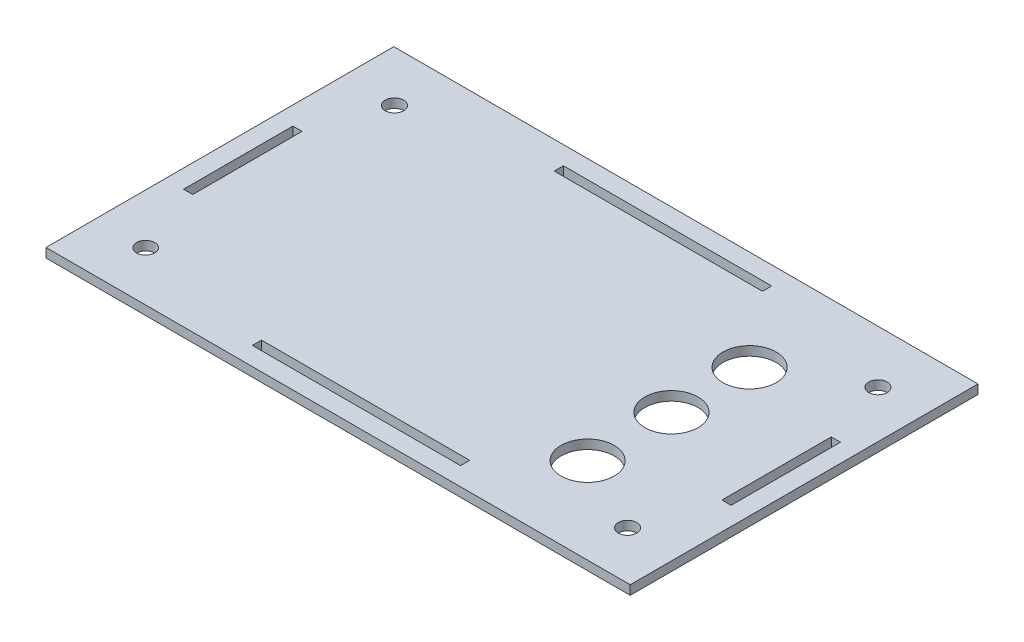
ISO-10303-21;
HEADER;
FILE_DESCRIPTION(('STEP AP214'),'2;1');
FILE_NAME('part.step','',(''),(''),'','','');
FILE_SCHEMA(('AUTOMOTIVE_DESIGN { 1 0 10303 214 1 1 1 1 }'));
ENDSEC;
DATA;
#1=APPLICATION_CONTEXT('core data for automotive mechanical design processes');
#2=APPLICATION_PROTOCOL_DEFINITION('international standard','automotive_design',2000,#1);
#3=PRODUCT_CONTEXT('',#1,'mechanical');
#4=PRODUCT('Part','Part','',(#3));
#5=PRODUCT_RELATED_PRODUCT_CATEGORY('part','',(#4));
#6=PRODUCT_DEFINITION_FORMATION('','',#4);
#7=PRODUCT_DEFINITION_CONTEXT('part definition',#1,'design');
#8=PRODUCT_DEFINITION('design','',#6,#7);
#9=PRODUCT_DEFINITION_SHAPE('','',#8);
#10=(LENGTH_UNIT() NAMED_UNIT(*) SI_UNIT(.MILLI.,.METRE.));
#11=(NAMED_UNIT(*) PLANE_ANGLE_UNIT() SI_UNIT($,.RADIAN.));
#12=(NAMED_UNIT(*) SI_UNIT($,.STERADIAN.) SOLID_ANGLE_UNIT());
#13=UNCERTAINTY_MEASURE_WITH_UNIT(LENGTH_MEASURE(1.E-05),#10,'distance_accuracy_value','');
#14=(GEOMETRIC_REPRESENTATION_CONTEXT(3) GLOBAL_UNCERTAINTY_ASSIGNED_CONTEXT((#13)) GLOBAL_UNIT_ASSIGNED_CONTEXT((#10,
#11,#12)) REPRESENTATION_CONTEXT('',''));
#15=CARTESIAN_POINT('',(0.,0.,0.));
#16=DIRECTION('',(0.,0.,1.));
#17=DIRECTION('',(1.,0.,0.));
#18=AXIS2_PLACEMENT_3D('',#15,#16,#17);
#19=CARTESIAN_POINT('',(0.,2.,0.));
#20=DIRECTION('',(0.,1.,0.));
#21=DIRECTION('',(0.,0.,1.));
#22=AXIS2_PLACEMENT_3D('',#19,#20,#21);
#23=PLANE('',#22);
#24=CARTESIAN_POINT('',(3.69534668895955,2.,-3.58517685274402));
#25=DIRECTION('',(0.,1.,0.));
#26=DIRECTION('',(0.,0.,1.));
#27=AXIS2_PLACEMENT_3D('',#24,#25,#26);
#28=CIRCLE('',#27,1.97543439169033);
#29=CARTESIAN_POINT('',(3.69534668895955,2.,-1.60974246105369));
#30=VERTEX_POINT('',#29);
#31=EDGE_CURVE('E567',#30,#30,#28,.T.);
#32=ORIENTED_EDGE('',*,*,#31,.F.);
#33=EDGE_LOOP('',(#32));
#34=FACE_BOUND('',#33,.T.);
#35=CARTESIAN_POINT('',(109.903070513536,2.,-57.085639350411));
#36=DIRECTION('',(0.,1.,0.));
#37=DIRECTION('',(0.,0.,1.));
#38=AXIS2_PLACEMENT_3D('',#35,#36,#37);
#39=CIRCLE('',#38,2.00578430429312);
#40=CARTESIAN_POINT('',(109.903070513536,2.,-55.0798550461179));
#41=VERTEX_POINT('',#40);
#42=EDGE_CURVE('E583',#41,#41,#39,.T.);
#43=ORIENTED_EDGE('',*,*,#42,.F.);
#44=EDGE_LOOP('',(#43));
#45=FACE_BOUND('',#44,.T.);
#46=DIRECTION('',(-1.,0.,0.));
#47=VECTOR('',#46,1.);
#48=CARTESIAN_POINT('',(79.1865431696985,2.,1.22187722593417));
#49=LINE('',#48,#47);
#50=CARTESIAN_POINT('',(79.1865431696985,2.,1.22187722593417));
#51=VERTEX_POINT('',#50);
#52=CARTESIAN_POINT('',(33.7765431696985,2.,1.22187722593417));
#53=VERTEX_POINT('',#52);
#54=EDGE_CURVE('E186',#51,#53,#49,.T.);
#55=ORIENTED_EDGE('',*,*,#54,.F.);
#56=DIRECTION('',(0.,0.,-1.));
#57=VECTOR('',#56,1.);
#58=CARTESIAN_POINT('',(79.1865431696985,2.,1.22187722593417));
#59=LINE('',#58,#57);
#60=CARTESIAN_POINT('',(79.1865431696985,2.,3.22187722593417));
#61=VERTEX_POINT('',#60);
#62=EDGE_CURVE('E177',#61,#51,#59,.T.);
#63=ORIENTED_EDGE('',*,*,#62,.F.);
#64=DIRECTION('',(1.,0.,0.));
#65=VECTOR('',#64,1.);
#66=CARTESIAN_POINT('',(79.1865431696985,2.,3.22187722593417));
#67=LINE('',#66,#65);
#68=CARTESIAN_POINT('',(33.7765431696985,2.,3.22187722593417));
#69=VERTEX_POINT('',#68);
#70=EDGE_CURVE('E204',#69,#61,#67,.T.);
#71=ORIENTED_EDGE('',*,*,#70,.F.);
#72=DIRECTION('',(0.,0.,1.));
#73=VECTOR('',#72,1.);
#74=CARTESIAN_POINT('',(33.7765431696985,2.,1.22187722593417));
#75=LINE('',#74,#73);
#76=EDGE_CURVE('E200',#53,#69,#75,.T.);
#77=ORIENTED_EDGE('',*,*,#76,.F.);
#78=EDGE_LOOP('',(#55,#63,#71,#77));
#79=FACE_BOUND('',#78,.T.);
#80=DIRECTION('',(1.,0.,0.));
#81=VECTOR('',#80,1.);
#82=CARTESIAN_POINT('',(114.186543169698,2.,-18.7781227740658));
#83=LINE('',#82,#81);
#84=CARTESIAN_POINT('',(114.186543169698,2.,-18.7781227740658));
#85=VERTEX_POINT('',#84);
#86=CARTESIAN_POINT('',(116.186543169698,2.,-18.7781227740658));
#87=VERTEX_POINT('',#86);
#88=EDGE_CURVE('E231',#85,#87,#83,.T.);
#89=ORIENTED_EDGE('',*,*,#88,.F.);
#90=DIRECTION('',(0.,0.,1.));
#91=VECTOR('',#90,1.);
#92=CARTESIAN_POINT('',(114.186543169698,2.,-42.6261227740658));
#93=LINE('',#92,#91);
#94=CARTESIAN_POINT('',(114.186543169698,2.,-42.6261227740658));
#95=VERTEX_POINT('',#94);
#96=EDGE_CURVE('E228',#95,#85,#93,.T.);
#97=ORIENTED_EDGE('',*,*,#96,.F.);
#98=DIRECTION('',(-1.,0.,0.));
#99=VECTOR('',#98,1.);
#100=CARTESIAN_POINT('',(114.186543169698,2.,-42.6261227740658));
#101=LINE('',#100,#99);
#102=CARTESIAN_POINT('',(116.186543169698,2.,-42.6261227740658));
#103=VERTEX_POINT('',#102);
#104=EDGE_CURVE('E239',#103,#95,#101,.T.);
#105=ORIENTED_EDGE('',*,*,#104,.F.);
#106=DIRECTION('',(0.,0.,-1.));
#107=VECTOR('',#106,1.);
#108=CARTESIAN_POINT('',(116.186543169698,2.,-42.6261227740658));
#109=LINE('',#108,#107);
#110=EDGE_CURVE('E235',#87,#103,#109,.T.);
#111=ORIENTED_EDGE('',*,*,#110,.F.);
#112=EDGE_LOOP('',(#89,#97,#105,#111));
#113=FACE_BOUND('',#112,.T.);
#114=DIRECTION('',(1.,0.,0.));
#115=VECTOR('',#114,1.);
#116=CARTESIAN_POINT('',(33.7765431696985,2.,-62.6261227740658));
#117=LINE('',#116,#115);
#118=CARTESIAN_POINT('',(33.7765431696985,2.,-62.6261227740658));
#119=VERTEX_POINT('',#118);
#120=CARTESIAN_POINT('',(79.1865431696985,2.,-62.6261227740658));
#121=VERTEX_POINT('',#120);
#122=EDGE_CURVE('E274',#119,#121,#117,.T.);
#123=ORIENTED_EDGE('',*,*,#122,.F.);
#124=DIRECTION('',(0.,0.,1.));
#125=VECTOR('',#124,1.);
#126=CARTESIAN_POINT('',(33.7765431696985,2.,-62.6261227740658));
#127=LINE('',#126,#125);
#128=CARTESIAN_POINT('',(33.7765431696985,2.,-64.6261227740658));
#129=VERTEX_POINT('',#128);
#130=EDGE_CURVE('E271',#129,#119,#127,.T.);
#131=ORIENTED_EDGE('',*,*,#130,.F.);
#132=DIRECTION('',(-1.,0.,0.));
#133=VECTOR('',#132,1.);
#134=CARTESIAN_POINT('',(33.7765431696985,2.,-64.6261227740658));
#135=LINE('',#134,#133);
#136=CARTESIAN_POINT('',(79.1865431696985,2.,-64.6261227740658));
#137=VERTEX_POINT('',#136);
#138=EDGE_CURVE('E282',#137,#129,#135,.T.);
#139=ORIENTED_EDGE('',*,*,#138,.F.);
#140=DIRECTION('',(0.,0.,-1.));
#141=VECTOR('',#140,1.);
#142=CARTESIAN_POINT('',(79.1865431696985,2.,-62.6261227740658));
#143=LINE('',#142,#141);
#144=EDGE_CURVE('E278',#121,#137,#143,.T.);
#145=ORIENTED_EDGE('',*,*,#144,.F.);
#146=EDGE_LOOP('',(#123,#131,#139,#145));
#147=FACE_BOUND('',#146,.T.);
#148=CARTESIAN_POINT('',(92.1136824989114,2.,-11.5633222726333));
#149=DIRECTION('',(0.,1.,0.));
#150=DIRECTION('',(0.,0.,1.));
#151=AXIS2_PLACEMENT_3D('',#148,#149,#150);
#152=CIRCLE('',#151,5.8);
#153=CARTESIAN_POINT('',(92.1136824989114,2.,-5.76332227263329));
#154=VERTEX_POINT('',#153);
#155=EDGE_CURVE('E314',#154,#154,#152,.T.);
#156=ORIENTED_EDGE('',*,*,#155,.F.);
#157=EDGE_LOOP('',(#156));
#158=FACE_BOUND('',#157,.T.);
#159=DIRECTION('',(-1.,0.,0.));
#160=VECTOR('',#159,1.);
#161=CARTESIAN_POINT('',(-1.22345683030151,2.,-42.6261227740658));
#162=LINE('',#161,#160);
#163=CARTESIAN_POINT('',(-1.22345683030151,2.,-42.6261227740658));
#164=VERTEX_POINT('',#163);
#165=CARTESIAN_POINT('',(-3.22345683030152,2.,-42.6261227740658));
#166=VERTEX_POINT('',#165);
#167=EDGE_CURVE('E333',#164,#166,#162,.T.);
#168=ORIENTED_EDGE('',*,*,#167,.F.);
#169=DIRECTION('',(0.,0.,-1.));
#170=VECTOR('',#169,1.);
#171=CARTESIAN_POINT('',(-1.22345683030151,2.,-42.6261227740658));
#172=LINE('',#171,#170);
#173=CARTESIAN_POINT('',(-1.22345683030151,2.,-18.7781227740658));
#174=VERTEX_POINT('',#173);
#175=EDGE_CURVE('E330',#174,#164,#172,.T.);
#176=ORIENTED_EDGE('',*,*,#175,.F.);
#177=DIRECTION('',(1.,0.,0.));
#178=VECTOR('',#177,1.);
#179=CARTESIAN_POINT('',(-1.22345683030151,2.,-18.7781227740658));
#180=LINE('',#179,#178);
#181=CARTESIAN_POINT('',(-3.22345683030152,2.,-18.7781227740658));
#182=VERTEX_POINT('',#181);
#183=EDGE_CURVE('E341',#182,#174,#180,.T.);
#184=ORIENTED_EDGE('',*,*,#183,.F.);
#185=DIRECTION('',(0.,0.,1.));
#186=VECTOR('',#185,1.);
#187=CARTESIAN_POINT('',(-3.22345683030152,2.,-42.6261227740658));
#188=LINE('',#187,#186);
#189=EDGE_CURVE('E337',#166,#182,#188,.T.);
#190=ORIENTED_EDGE('',*,*,#189,.F.);
#191=EDGE_LOOP('',(#168,#176,#184,#190));
#192=FACE_BOUND('',#191,.T.);
#193=DIRECTION('',(0.,0.,1.));
#194=VECTOR('',#193,1.);
#195=CARTESIAN_POINT('',(-7.22345683030153,2.,-68.6261227740658));
#196=LINE('',#195,#194);
#197=CARTESIAN_POINT('',(-7.22345683030153,2.,-68.6261227740658));
#198=VERTEX_POINT('',#197);
#199=CARTESIAN_POINT('',(-7.22345683030152,2.,7.22187722593417));
#200=VERTEX_POINT('',#199);
#201=EDGE_CURVE('E373',#198,#200,#196,.T.);
#202=ORIENTED_EDGE('',*,*,#201,.T.);
#203=DIRECTION('',(1.,0.,0.));
#204=VECTOR('',#203,1.);
#205=CARTESIAN_POINT('',(-7.22345683030152,2.,7.22187722593417));
#206=LINE('',#205,#204);
#207=CARTESIAN_POINT('',(120.186543169698,2.,7.22187722593417));
#208=VERTEX_POINT('',#207);
#209=EDGE_CURVE('E377',#200,#208,#206,.T.);
#210=ORIENTED_EDGE('',*,*,#209,.T.);
#211=DIRECTION('',(0.,0.,-1.));
#212=VECTOR('',#211,1.);
#213=CARTESIAN_POINT('',(120.186543169698,2.,-68.6261227740658));
#214=LINE('',#213,#212);
#215=CARTESIAN_POINT('',(120.186543169698,2.,-68.6261227740658));
#216=VERTEX_POINT('',#215);
#217=EDGE_CURVE('E381',#208,#216,#214,.T.);
#218=ORIENTED_EDGE('',*,*,#217,.T.);
#219=DIRECTION('',(-1.,0.,0.));
#220=VECTOR('',#219,1.);
#221=CARTESIAN_POINT('',(-7.22345683030153,2.,-68.6261227740658));
#222=LINE('',#221,#220);
#223=EDGE_CURVE('E384',#216,#198,#222,.T.);
#224=ORIENTED_EDGE('',*,*,#223,.T.);
#225=EDGE_LOOP('',(#202,#210,#218,#224));
#226=FACE_BOUND('',#225,.T.);
#227=CARTESIAN_POINT('',(92.1136824989114,2.,-29.8506259216308));
#228=DIRECTION('',(0.,1.,0.));
#229=DIRECTION('',(0.,0.,1.));
#230=AXIS2_PLACEMENT_3D('',#227,#228,#229);
#231=CIRCLE('',#230,5.8);
#232=CARTESIAN_POINT('',(92.1136824989114,2.,-24.0506259216308));
#233=VERTEX_POINT('',#232);
#234=EDGE_CURVE('E322',#233,#233,#231,.T.);
#235=ORIENTED_EDGE('',*,*,#234,.F.);
#236=EDGE_LOOP('',(#235));
#237=FACE_BOUND('',#236,.T.);
#238=CARTESIAN_POINT('',(92.1319486281561,2.,-46.8634837449279));
#239=DIRECTION('',(0.,1.,0.));
#240=DIRECTION('',(0.,0.,1.));
#241=AXIS2_PLACEMENT_3D('',#238,#239,#240);
#242=CIRCLE('',#241,5.8);
#243=CARTESIAN_POINT('',(92.1319486281561,2.,-41.0634837449279));
#244=VERTEX_POINT('',#243);
#245=EDGE_CURVE('E212',#244,#244,#242,.T.);
#246=ORIENTED_EDGE('',*,*,#245,.F.);
#247=EDGE_LOOP('',(#246));
#248=FACE_BOUND('',#247,.T.);
#249=CARTESIAN_POINT('',(109.140500171472,2.,-3.23821550651677));
#250=DIRECTION('',(0.,1.,0.));
#251=DIRECTION('',(0.,0.,1.));
#252=AXIS2_PLACEMENT_3D('',#249,#250,#251);
#253=CIRCLE('',#252,2.00764752498284);
#254=CARTESIAN_POINT('',(109.140500171472,2.,-1.23056798153392));
#255=VERTEX_POINT('',#254);
#256=EDGE_CURVE('E575',#255,#255,#253,.T.);
#257=ORIENTED_EDGE('',*,*,#256,.F.);
#258=EDGE_LOOP('',(#257));
#259=FACE_BOUND('',#258,.T.);
#260=CARTESIAN_POINT('',(3.94520992792013,2.,-57.6065574065732));
#261=DIRECTION('',(0.,1.,0.));
#262=DIRECTION('',(0.,0.,1.));
#263=AXIS2_PLACEMENT_3D('',#260,#261,#262);
#264=CIRCLE('',#263,2.02059865968082);
#265=CARTESIAN_POINT('',(3.94520992792013,2.,-55.5859587468924));
#266=VERTEX_POINT('',#265);
#267=EDGE_CURVE('E556',#266,#266,#264,.T.);
#268=ORIENTED_EDGE('',*,*,#267,.F.);
#269=EDGE_LOOP('',(#268));
#270=FACE_BOUND('',#269,.T.);
#271=ADVANCED_FACE('F39',(#34,#45,#79,#113,#147,#158,#192,#226,#237,#248,#259,#270),#23,.T.);
#272=CARTESIAN_POINT('',(0.,0.,0.));
#273=DIRECTION('',(0.,1.,0.));
#274=DIRECTION('',(0.,0.,1.));
#275=AXIS2_PLACEMENT_3D('',#272,#273,#274);
#276=PLANE('',#275);
#277=DIRECTION('',(0.,0.,1.));
#278=VECTOR('',#277,1.);
#279=CARTESIAN_POINT('',(114.186543169698,0.,-42.6261227740658));
#280=LINE('',#279,#278);
#281=CARTESIAN_POINT('',(114.186543169698,0.,-42.6261227740658));
#282=VERTEX_POINT('',#281);
#283=CARTESIAN_POINT('',(114.186543169698,0.,-18.7781227740658));
#284=VERTEX_POINT('',#283);
#285=EDGE_CURVE('E195',#282,#284,#280,.T.);
#286=ORIENTED_EDGE('',*,*,#285,.T.);
#287=DIRECTION('',(1.,0.,0.));
#288=VECTOR('',#287,1.);
#289=CARTESIAN_POINT('',(114.186543169698,0.,-18.7781227740658));
#290=LINE('',#289,#288);
#291=CARTESIAN_POINT('',(116.186543169698,0.,-18.7781227740658));
#292=VERTEX_POINT('',#291);
#293=EDGE_CURVE('E246',#284,#292,#290,.T.);
#294=ORIENTED_EDGE('',*,*,#293,.T.);
#295=DIRECTION('',(0.,0.,-1.));
#296=VECTOR('',#295,1.);
#297=CARTESIAN_POINT('',(116.186543169698,0.,-42.6261227740658));
#298=LINE('',#297,#296);
#299=CARTESIAN_POINT('',(116.186543169698,0.,-42.6261227740658));
#300=VERTEX_POINT('',#299);
#301=EDGE_CURVE('E250',#292,#300,#298,.T.);
#302=ORIENTED_EDGE('',*,*,#301,.T.);
#303=DIRECTION('',(-1.,0.,0.));
#304=VECTOR('',#303,1.);
#305=CARTESIAN_POINT('',(114.186543169698,0.,-42.6261227740658));
#306=LINE('',#305,#304);
#307=EDGE_CURVE('E232',#300,#282,#306,.T.);
#308=ORIENTED_EDGE('',*,*,#307,.T.);
#309=EDGE_LOOP('',(#286,#294,#302,#308));
#310=FACE_BOUND('',#309,.T.);
#311=CARTESIAN_POINT('',(92.1136824989114,0.,-11.5633222726333));
#312=DIRECTION('',(0.,1.,0.));
#313=DIRECTION('',(0.,0.,1.));
#314=AXIS2_PLACEMENT_3D('',#311,#312,#313);
#315=CIRCLE('',#314,5.8);
#316=CARTESIAN_POINT('',(92.1136824989114,0.,-5.76332227263329));
#317=VERTEX_POINT('',#316);
#318=EDGE_CURVE('E313',#317,#317,#315,.T.);
#319=ORIENTED_EDGE('',*,*,#318,.T.);
#320=EDGE_LOOP('',(#319));
#321=FACE_BOUND('',#320,.T.);
#322=CARTESIAN_POINT('',(92.1136824989114,0.,-29.8506259216308));
#323=DIRECTION('',(0.,1.,0.));
#324=DIRECTION('',(0.,0.,1.));
#325=AXIS2_PLACEMENT_3D('',#322,#323,#324);
#326=CIRCLE('',#325,5.8);
#327=CARTESIAN_POINT('',(92.1136824989114,0.,-24.0506259216308));
#328=VERTEX_POINT('',#327);
#329=EDGE_CURVE('E318',#328,#328,#326,.T.);
#330=ORIENTED_EDGE('',*,*,#329,.T.);
#331=EDGE_LOOP('',(#330));
#332=FACE_BOUND('',#331,.T.);
#333=DIRECTION('',(0.,0.,-1.));
#334=VECTOR('',#333,1.);
#335=CARTESIAN_POINT('',(-1.22345683030151,0.,-42.6261227740658));
#336=LINE('',#335,#334);
#337=CARTESIAN_POINT('',(-1.22345683030151,0.,-18.7781227740658));
#338=VERTEX_POINT('',#337);
#339=CARTESIAN_POINT('',(-1.22345683030151,0.,-42.6261227740658));
#340=VERTEX_POINT('',#339);
#341=EDGE_CURVE('E326',#338,#340,#336,.T.);
#342=ORIENTED_EDGE('',*,*,#341,.T.);
#343=DIRECTION('',(-1.,0.,0.));
#344=VECTOR('',#343,1.);
#345=CARTESIAN_POINT('',(-1.22345683030151,0.,-42.6261227740658));
#346=LINE('',#345,#344);
#347=CARTESIAN_POINT('',(-3.22345683030152,0.,-42.6261227740658));
#348=VERTEX_POINT('',#347);
#349=EDGE_CURVE('E348',#340,#348,#346,.T.);
#350=ORIENTED_EDGE('',*,*,#349,.T.);
#351=DIRECTION('',(0.,0.,1.));
#352=VECTOR('',#351,1.);
#353=CARTESIAN_POINT('',(-3.22345683030152,0.,-42.6261227740658));
#354=LINE('',#353,#352);
#355=CARTESIAN_POINT('',(-3.22345683030152,0.,-18.7781227740658));
#356=VERTEX_POINT('',#355);
#357=EDGE_CURVE('E352',#348,#356,#354,.T.);
#358=ORIENTED_EDGE('',*,*,#357,.T.);
#359=DIRECTION('',(1.,0.,0.));
#360=VECTOR('',#359,1.);
#361=CARTESIAN_POINT('',(-1.22345683030151,0.,-18.7781227740658));
#362=LINE('',#361,#360);
#363=EDGE_CURVE('E334',#356,#338,#362,.T.);
#364=ORIENTED_EDGE('',*,*,#363,.T.);
#365=EDGE_LOOP('',(#342,#350,#358,#364));
#366=FACE_BOUND('',#365,.T.);
#367=DIRECTION('',(0.,0.,1.));
#368=VECTOR('',#367,1.);
#369=CARTESIAN_POINT('',(-7.22345683030153,0.,-68.6261227740658));
#370=LINE('',#369,#368);
#371=CARTESIAN_POINT('',(-7.22345683030153,0.,-68.6261227740658));
#372=VERTEX_POINT('',#371);
#373=CARTESIAN_POINT('',(-7.22345683030152,0.,7.22187722593417));
#374=VERTEX_POINT('',#373);
#375=EDGE_CURVE('E372',#372,#374,#370,.T.);
#376=ORIENTED_EDGE('',*,*,#375,.F.);
#377=DIRECTION('',(-1.,0.,0.));
#378=VECTOR('',#377,1.);
#379=CARTESIAN_POINT('',(-7.22345683030153,0.,-68.6261227740658));
#380=LINE('',#379,#378);
#381=CARTESIAN_POINT('',(120.186543169698,0.,-68.6261227740658));
#382=VERTEX_POINT('',#381);
#383=EDGE_CURVE('E378',#382,#372,#380,.T.);
#384=ORIENTED_EDGE('',*,*,#383,.F.);
#385=DIRECTION('',(0.,0.,-1.));
#386=VECTOR('',#385,1.);
#387=CARTESIAN_POINT('',(120.186543169698,0.,-68.6261227740658));
#388=LINE('',#387,#386);
#389=CARTESIAN_POINT('',(120.186543169698,0.,7.22187722593417));
#390=VERTEX_POINT('',#389);
#391=EDGE_CURVE('E394',#390,#382,#388,.T.);
#392=ORIENTED_EDGE('',*,*,#391,.F.);
#393=DIRECTION('',(1.,0.,0.));
#394=VECTOR('',#393,1.);
#395=CARTESIAN_POINT('',(-7.22345683030152,0.,7.22187722593417));
#396=LINE('',#395,#394);
#397=EDGE_CURVE('E391',#374,#390,#396,.T.);
#398=ORIENTED_EDGE('',*,*,#397,.F.);
#399=EDGE_LOOP('',(#376,#384,#392,#398));
#400=FACE_BOUND('',#399,.T.);
#401=DIRECTION('',(0.,0.,1.));
#402=VECTOR('',#401,1.);
#403=CARTESIAN_POINT('',(33.7765431696985,0.,-62.6261227740658));
#404=LINE('',#403,#402);
#405=CARTESIAN_POINT('',(33.7765431696985,0.,-64.6261227740658));
#406=VERTEX_POINT('',#405);
#407=CARTESIAN_POINT('',(33.7765431696985,0.,-62.6261227740658));
#408=VERTEX_POINT('',#407);
#409=EDGE_CURVE('E270',#406,#408,#404,.T.);
#410=ORIENTED_EDGE('',*,*,#409,.T.);
#411=DIRECTION('',(1.,0.,0.));
#412=VECTOR('',#411,1.);
#413=CARTESIAN_POINT('',(33.7765431696985,0.,-62.6261227740658));
#414=LINE('',#413,#412);
#415=CARTESIAN_POINT('',(79.1865431696985,0.,-62.6261227740658));
#416=VERTEX_POINT('',#415);
#417=EDGE_CURVE('E289',#408,#416,#414,.T.);
#418=ORIENTED_EDGE('',*,*,#417,.T.);
#419=DIRECTION('',(0.,0.,-1.));
#420=VECTOR('',#419,1.);
#421=CARTESIAN_POINT('',(79.1865431696985,0.,-62.6261227740658));
#422=LINE('',#421,#420);
#423=CARTESIAN_POINT('',(79.1865431696985,0.,-64.6261227740658));
#424=VERTEX_POINT('',#423);
#425=EDGE_CURVE('E293',#416,#424,#422,.T.);
#426=ORIENTED_EDGE('',*,*,#425,.T.);
#427=DIRECTION('',(-1.,0.,0.));
#428=VECTOR('',#427,1.);
#429=CARTESIAN_POINT('',(33.7765431696985,0.,-64.6261227740658));
#430=LINE('',#429,#428);
#431=EDGE_CURVE('E275',#424,#406,#430,.T.);
#432=ORIENTED_EDGE('',*,*,#431,.T.);
#433=EDGE_LOOP('',(#410,#418,#426,#432));
#434=FACE_BOUND('',#433,.T.);
#435=DIRECTION('',(0.,0.,-1.));
#436=VECTOR('',#435,1.);
#437=CARTESIAN_POINT('',(79.1865431696985,0.,1.22187722593417));
#438=LINE('',#437,#436);
#439=CARTESIAN_POINT('',(79.1865431696985,0.,3.22187722593417));
#440=VERTEX_POINT('',#439);
#441=CARTESIAN_POINT('',(79.1865431696985,0.,1.22187722593417));
#442=VERTEX_POINT('',#441);
#443=EDGE_CURVE('E63',#440,#442,#438,.T.);
#444=ORIENTED_EDGE('',*,*,#443,.T.);
#445=DIRECTION('',(-1.,0.,0.));
#446=VECTOR('',#445,1.);
#447=CARTESIAN_POINT('',(79.1865431696985,0.,1.22187722593417));
#448=LINE('',#447,#446);
#449=CARTESIAN_POINT('',(33.7765431696985,0.,1.22187722593417));
#450=VERTEX_POINT('',#449);
#451=EDGE_CURVE('E193',#442,#450,#448,.T.);
#452=ORIENTED_EDGE('',*,*,#451,.T.);
#453=DIRECTION('',(0.,0.,1.));
#454=VECTOR('',#453,1.);
#455=CARTESIAN_POINT('',(33.7765431696985,0.,1.22187722593417));
#456=LINE('',#455,#454);
#457=CARTESIAN_POINT('',(33.7765431696985,0.,3.22187722593417));
#458=VERTEX_POINT('',#457);
#459=EDGE_CURVE('E215',#450,#458,#456,.T.);
#460=ORIENTED_EDGE('',*,*,#459,.T.);
#461=DIRECTION('',(1.,0.,0.));
#462=VECTOR('',#461,1.);
#463=CARTESIAN_POINT('',(79.1865431696985,0.,3.22187722593417));
#464=LINE('',#463,#462);
#465=EDGE_CURVE('E187',#458,#440,#464,.T.);
#466=ORIENTED_EDGE('',*,*,#465,.T.);
#467=EDGE_LOOP('',(#444,#452,#460,#466));
#468=FACE_BOUND('',#467,.T.);
#469=CARTESIAN_POINT('',(92.1319486281561,0.,-46.8634837449279));
#470=DIRECTION('',(0.,1.,0.));
#471=DIRECTION('',(0.,0.,1.));
#472=AXIS2_PLACEMENT_3D('',#469,#470,#471);
#473=CIRCLE('',#472,5.8);
#474=CARTESIAN_POINT('',(92.1319486281561,0.,-41.0634837449279));
#475=VERTEX_POINT('',#474);
#476=EDGE_CURVE('E587',#475,#475,#473,.T.);
#477=ORIENTED_EDGE('',*,*,#476,.T.);
#478=EDGE_LOOP('',(#477));
#479=FACE_BOUND('',#478,.T.);
#480=CARTESIAN_POINT('',(109.903070513536,0.,-57.085639350411));
#481=DIRECTION('',(0.,1.,0.));
#482=DIRECTION('',(0.,0.,1.));
#483=AXIS2_PLACEMENT_3D('',#480,#481,#482);
#484=CIRCLE('',#483,2.00578430429312);
#485=CARTESIAN_POINT('',(109.903070513536,0.,-55.0798550461179));
#486=VERTEX_POINT('',#485);
#487=EDGE_CURVE('E579',#486,#486,#484,.T.);
#488=ORIENTED_EDGE('',*,*,#487,.T.);
#489=EDGE_LOOP('',(#488));
#490=FACE_BOUND('',#489,.T.);
#491=CARTESIAN_POINT('',(109.140500171472,0.,-3.23821550651677));
#492=DIRECTION('',(0.,1.,0.));
#493=DIRECTION('',(0.,0.,1.));
#494=AXIS2_PLACEMENT_3D('',#491,#492,#493);
#495=CIRCLE('',#494,2.00764752498284);
#496=CARTESIAN_POINT('',(109.140500171472,0.,-1.23056798153392));
#497=VERTEX_POINT('',#496);
#498=EDGE_CURVE('E571',#497,#497,#495,.T.);
#499=ORIENTED_EDGE('',*,*,#498,.T.);
#500=EDGE_LOOP('',(#499));
#501=FACE_BOUND('',#500,.T.);
#502=CARTESIAN_POINT('',(3.69534668895955,0.,-3.58517685274402));
#503=DIRECTION('',(0.,1.,0.));
#504=DIRECTION('',(0.,0.,1.));
#505=AXIS2_PLACEMENT_3D('',#502,#503,#504);
#506=CIRCLE('',#505,1.97543439169033);
#507=CARTESIAN_POINT('',(3.69534668895955,0.,-1.60974246105369));
#508=VERTEX_POINT('',#507);
#509=EDGE_CURVE('E564',#508,#508,#506,.T.);
#510=ORIENTED_EDGE('',*,*,#509,.T.);
#511=EDGE_LOOP('',(#510));
#512=FACE_BOUND('',#511,.T.);
#513=CARTESIAN_POINT('',(3.94520992792013,0.,-57.6065574065732));
#514=DIRECTION('',(0.,1.,0.));
#515=DIRECTION('',(0.,0.,1.));
#516=AXIS2_PLACEMENT_3D('',#513,#514,#515);
#517=CIRCLE('',#516,2.02059865968082);
#518=CARTESIAN_POINT('',(3.94520992792013,0.,-55.5859587468924));
#519=VERTEX_POINT('',#518);
#520=EDGE_CURVE('E559',#519,#519,#517,.T.);
#521=ORIENTED_EDGE('',*,*,#520,.T.);
#522=EDGE_LOOP('',(#521));
#523=FACE_BOUND('',#522,.T.);
#524=ADVANCED_FACE('F417',(#310,#321,#332,#366,#400,#434,#468,#479,#490,#501,#512,#523),#276,.F.);
#525=CARTESIAN_POINT('',(-7.22345683030153,2.,-68.6261227740658));
#526=DIRECTION('',(1.,0.,0.));
#527=DIRECTION('',(0.,0.,-1.));
#528=AXIS2_PLACEMENT_3D('',#525,#526,#527);
#529=PLANE('',#528);
#530=ORIENTED_EDGE('',*,*,#375,.T.);
#531=DIRECTION('',(0.,-1.,0.));
#532=VECTOR('',#531,1.);
#533=CARTESIAN_POINT('',(-7.22345683030152,2.,7.22187722593417));
#534=LINE('',#533,#532);
#535=EDGE_CURVE('E11',#200,#374,#534,.T.);
#536=ORIENTED_EDGE('',*,*,#535,.F.);
#537=ORIENTED_EDGE('',*,*,#201,.F.);
#538=DIRECTION('',(0.,-1.,0.));
#539=VECTOR('',#538,1.);
#540=CARTESIAN_POINT('',(-7.22345683030153,2.,-68.6261227740658));
#541=LINE('',#540,#539);
#542=EDGE_CURVE('E387',#198,#372,#541,.T.);
#543=ORIENTED_EDGE('',*,*,#542,.T.);
#544=EDGE_LOOP('',(#530,#536,#537,#543));
#545=FACE_BOUND('',#544,.T.);
#546=ADVANCED_FACE('F41',(#545),#529,.F.);
#547=CARTESIAN_POINT('',(-7.22345683030152,2.,7.22187722593417));
#548=DIRECTION('',(0.,0.,-1.));
#549=DIRECTION('',(-1.,0.,0.));
#550=AXIS2_PLACEMENT_3D('',#547,#548,#549);
#551=PLANE('',#550);
#552=ORIENTED_EDGE('',*,*,#397,.T.);
#553=DIRECTION('',(0.,-1.,0.));
#554=VECTOR('',#553,1.);
#555=CARTESIAN_POINT('',(120.186543169698,2.,7.22187722593417));
#556=LINE('',#555,#554);
#557=EDGE_CURVE('E48',#208,#390,#556,.T.);
#558=ORIENTED_EDGE('',*,*,#557,.F.);
#559=ORIENTED_EDGE('',*,*,#209,.F.);
#560=ORIENTED_EDGE('',*,*,#535,.T.);
#561=EDGE_LOOP('',(#552,#558,#559,#560));
#562=FACE_BOUND('',#561,.T.);
#563=ADVANCED_FACE('F428',(#562),#551,.F.);
#564=CARTESIAN_POINT('',(120.186543169698,2.,-68.6261227740658));
#565=DIRECTION('',(-1.,0.,0.));
#566=DIRECTION('',(0.,0.,1.));
#567=AXIS2_PLACEMENT_3D('',#564,#565,#566);
#568=PLANE('',#567);
#569=ORIENTED_EDGE('',*,*,#391,.T.);
#570=DIRECTION('',(0.,-1.,0.));
#571=VECTOR('',#570,1.);
#572=CARTESIAN_POINT('',(120.186543169698,2.,-68.6261227740658));
#573=LINE('',#572,#571);
#574=EDGE_CURVE('E402',#216,#382,#573,.T.);
#575=ORIENTED_EDGE('',*,*,#574,.F.);
#576=ORIENTED_EDGE('',*,*,#217,.F.);
#577=ORIENTED_EDGE('',*,*,#557,.T.);
#578=EDGE_LOOP('',(#569,#575,#576,#577));
#579=FACE_BOUND('',#578,.T.);
#580=ADVANCED_FACE('F411',(#579),#568,.F.);
#581=CARTESIAN_POINT('',(-7.22345683030153,2.,-68.6261227740658));
#582=DIRECTION('',(0.,0.,1.));
#583=DIRECTION('',(1.,0.,0.));
#584=AXIS2_PLACEMENT_3D('',#581,#582,#583);
#585=PLANE('',#584);
#586=ORIENTED_EDGE('',*,*,#383,.T.);
#587=ORIENTED_EDGE('',*,*,#542,.F.);
#588=ORIENTED_EDGE('',*,*,#223,.F.);
#589=ORIENTED_EDGE('',*,*,#574,.T.);
#590=EDGE_LOOP('',(#586,#587,#588,#589));
#591=FACE_BOUND('',#590,.T.);
#592=ADVANCED_FACE('F421',(#591),#585,.F.);
#593=CARTESIAN_POINT('',(-1.22345683030151,2.,-42.6261227740658));
#594=DIRECTION('',(-1.,0.,0.));
#595=DIRECTION('',(0.,0.,1.));
#596=AXIS2_PLACEMENT_3D('',#593,#594,#595);
#597=PLANE('',#596);
#598=ORIENTED_EDGE('',*,*,#341,.F.);
#599=DIRECTION('',(0.,-1.,0.));
#600=VECTOR('',#599,1.);
#601=CARTESIAN_POINT('',(-1.22345683030151,2.,-18.7781227740658));
#602=LINE('',#601,#600);
#603=EDGE_CURVE('E344',#174,#338,#602,.T.);
#604=ORIENTED_EDGE('',*,*,#603,.F.);
#605=ORIENTED_EDGE('',*,*,#175,.T.);
#606=DIRECTION('',(0.,-1.,0.));
#607=VECTOR('',#606,1.);
#608=CARTESIAN_POINT('',(-1.22345683030151,2.,-42.6261227740658));
#609=LINE('',#608,#607);
#610=EDGE_CURVE('E368',#164,#340,#609,.T.);
#611=ORIENTED_EDGE('',*,*,#610,.T.);
#612=EDGE_LOOP('',(#598,#604,#605,#611));
#613=FACE_BOUND('',#612,.T.);
#614=ADVANCED_FACE('F446',(#613),#597,.T.);
#615=CARTESIAN_POINT('',(-1.22345683030151,2.,-42.6261227740658));
#616=DIRECTION('',(0.,0.,1.));
#617=DIRECTION('',(1.,0.,0.));
#618=AXIS2_PLACEMENT_3D('',#615,#616,#617);
#619=PLANE('',#618);
#620=ORIENTED_EDGE('',*,*,#349,.F.);
#621=ORIENTED_EDGE('',*,*,#610,.F.);
#622=ORIENTED_EDGE('',*,*,#167,.T.);
#623=DIRECTION('',(0.,-1.,0.));
#624=VECTOR('',#623,1.);
#625=CARTESIAN_POINT('',(-3.22345683030152,2.,-42.6261227740658));
#626=LINE('',#625,#624);
#627=EDGE_CURVE('E365',#166,#348,#626,.T.);
#628=ORIENTED_EDGE('',*,*,#627,.T.);
#629=EDGE_LOOP('',(#620,#621,#622,#628));
#630=FACE_BOUND('',#629,.T.);
#631=ADVANCED_FACE('F453',(#630),#619,.T.);
#632=CARTESIAN_POINT('',(-3.22345683030152,2.,-42.6261227740658));
#633=DIRECTION('',(1.,0.,0.));
#634=DIRECTION('',(0.,0.,-1.));
#635=AXIS2_PLACEMENT_3D('',#632,#633,#634);
#636=PLANE('',#635);
#637=ORIENTED_EDGE('',*,*,#357,.F.);
#638=ORIENTED_EDGE('',*,*,#627,.F.);
#639=ORIENTED_EDGE('',*,*,#189,.T.);
#640=DIRECTION('',(0.,-1.,0.));
#641=VECTOR('',#640,1.);
#642=CARTESIAN_POINT('',(-3.22345683030152,2.,-18.7781227740658));
#643=LINE('',#642,#641);
#644=EDGE_CURVE('E362',#182,#356,#643,.T.);
#645=ORIENTED_EDGE('',*,*,#644,.T.);
#646=EDGE_LOOP('',(#637,#638,#639,#645));
#647=FACE_BOUND('',#646,.T.);
#648=ADVANCED_FACE('F458',(#647),#636,.T.);
#649=CARTESIAN_POINT('',(-1.22345683030151,2.,-18.7781227740658));
#650=DIRECTION('',(0.,0.,-1.));
#651=DIRECTION('',(-1.,0.,0.));
#652=AXIS2_PLACEMENT_3D('',#649,#650,#651);
#653=PLANE('',#652);
#654=ORIENTED_EDGE('',*,*,#363,.F.);
#655=ORIENTED_EDGE('',*,*,#644,.F.);
#656=ORIENTED_EDGE('',*,*,#183,.T.);
#657=ORIENTED_EDGE('',*,*,#603,.T.);
#658=EDGE_LOOP('',(#654,#655,#656,#657));
#659=FACE_BOUND('',#658,.T.);
#660=ADVANCED_FACE('F466',(#659),#653,.T.);
#661=CARTESIAN_POINT('',(92.1136824989114,2.,-29.8506259216308));
#662=DIRECTION('',(0.,-1.,0.));
#663=DIRECTION('',(0.,0.,-1.));
#664=AXIS2_PLACEMENT_3D('',#661,#662,#663);
#665=CYLINDRICAL_SURFACE('',#664,5.8);
#666=ORIENTED_EDGE('',*,*,#234,.T.);
#667=EDGE_LOOP('',(#666));
#668=FACE_BOUND('',#667,.T.);
#669=ORIENTED_EDGE('',*,*,#329,.F.);
#670=EDGE_LOOP('',(#669));
#671=FACE_BOUND('',#670,.T.);
#672=ADVANCED_FACE('F479',(#668,#671),#665,.F.);
#673=CARTESIAN_POINT('',(92.1136824989114,2.,-11.5633222726333));
#674=DIRECTION('',(0.,-1.,0.));
#675=DIRECTION('',(0.,0.,-1.));
#676=AXIS2_PLACEMENT_3D('',#673,#674,#675);
#677=CYLINDRICAL_SURFACE('',#676,5.8);
#678=ORIENTED_EDGE('',*,*,#155,.T.);
#679=EDGE_LOOP('',(#678));
#680=FACE_BOUND('',#679,.T.);
#681=ORIENTED_EDGE('',*,*,#318,.F.);
#682=EDGE_LOOP('',(#681));
#683=FACE_BOUND('',#682,.T.);
#684=ADVANCED_FACE('F484',(#680,#683),#677,.F.);
#685=CARTESIAN_POINT('',(33.7765431696985,2.,-62.6261227740658));
#686=DIRECTION('',(1.,0.,0.));
#687=DIRECTION('',(0.,0.,-1.));
#688=AXIS2_PLACEMENT_3D('',#685,#686,#687);
#689=PLANE('',#688);
#690=ORIENTED_EDGE('',*,*,#409,.F.);
#691=DIRECTION('',(0.,-1.,0.));
#692=VECTOR('',#691,1.);
#693=CARTESIAN_POINT('',(33.7765431696985,2.,-64.6261227740658));
#694=LINE('',#693,#692);
#695=EDGE_CURVE('E285',#129,#406,#694,.T.);
#696=ORIENTED_EDGE('',*,*,#695,.F.);
#697=ORIENTED_EDGE('',*,*,#130,.T.);
#698=DIRECTION('',(0.,-1.,0.));
#699=VECTOR('',#698,1.);
#700=CARTESIAN_POINT('',(33.7765431696985,2.,-62.6261227740658));
#701=LINE('',#700,#699);
#702=EDGE_CURVE('E309',#119,#408,#701,.T.);
#703=ORIENTED_EDGE('',*,*,#702,.T.);
#704=EDGE_LOOP('',(#690,#696,#697,#703));
#705=FACE_BOUND('',#704,.T.);
#706=ADVANCED_FACE('F488',(#705),#689,.T.);
#707=CARTESIAN_POINT('',(33.7765431696985,2.,-62.6261227740658));
#708=DIRECTION('',(0.,0.,-1.));
#709=DIRECTION('',(-1.,0.,0.));
#710=AXIS2_PLACEMENT_3D('',#707,#708,#709);
#711=PLANE('',#710);
#712=ORIENTED_EDGE('',*,*,#417,.F.);
#713=ORIENTED_EDGE('',*,*,#702,.F.);
#714=ORIENTED_EDGE('',*,*,#122,.T.);
#715=DIRECTION('',(0.,-1.,0.));
#716=VECTOR('',#715,1.);
#717=CARTESIAN_POINT('',(79.1865431696985,2.,-62.6261227740658));
#718=LINE('',#717,#716);
#719=EDGE_CURVE('E306',#121,#416,#718,.T.);
#720=ORIENTED_EDGE('',*,*,#719,.T.);
#721=EDGE_LOOP('',(#712,#713,#714,#720));
#722=FACE_BOUND('',#721,.T.);
#723=ADVANCED_FACE('F492',(#722),#711,.T.);
#724=CARTESIAN_POINT('',(79.1865431696985,2.,-62.6261227740658));
#725=DIRECTION('',(-1.,0.,0.));
#726=DIRECTION('',(0.,0.,1.));
#727=AXIS2_PLACEMENT_3D('',#724,#725,#726);
#728=PLANE('',#727);
#729=ORIENTED_EDGE('',*,*,#425,.F.);
#730=ORIENTED_EDGE('',*,*,#719,.F.);
#731=ORIENTED_EDGE('',*,*,#144,.T.);
#732=DIRECTION('',(0.,-1.,0.));
#733=VECTOR('',#732,1.);
#734=CARTESIAN_POINT('',(79.1865431696985,2.,-64.6261227740658));
#735=LINE('',#734,#733);
#736=EDGE_CURVE('E303',#137,#424,#735,.T.);
#737=ORIENTED_EDGE('',*,*,#736,.T.);
#738=EDGE_LOOP('',(#729,#730,#731,#737));
#739=FACE_BOUND('',#738,.T.);
#740=ADVANCED_FACE('F496',(#739),#728,.T.);
#741=CARTESIAN_POINT('',(33.7765431696985,2.,-64.6261227740658));
#742=DIRECTION('',(0.,0.,1.));
#743=DIRECTION('',(1.,0.,0.));
#744=AXIS2_PLACEMENT_3D('',#741,#742,#743);
#745=PLANE('',#744);
#746=ORIENTED_EDGE('',*,*,#431,.F.);
#747=ORIENTED_EDGE('',*,*,#736,.F.);
#748=ORIENTED_EDGE('',*,*,#138,.T.);
#749=ORIENTED_EDGE('',*,*,#695,.T.);
#750=EDGE_LOOP('',(#746,#747,#748,#749));
#751=FACE_BOUND('',#750,.T.);
#752=ADVANCED_FACE('F500',(#751),#745,.T.);
#753=CARTESIAN_POINT('',(114.186543169698,2.,-42.6261227740658));
#754=DIRECTION('',(1.,0.,0.));
#755=DIRECTION('',(0.,0.,-1.));
#756=AXIS2_PLACEMENT_3D('',#753,#754,#755);
#757=PLANE('',#756);
#758=ORIENTED_EDGE('',*,*,#285,.F.);
#759=DIRECTION('',(0.,-1.,0.));
#760=VECTOR('',#759,1.);
#761=CARTESIAN_POINT('',(114.186543169698,2.,-42.6261227740658));
#762=LINE('',#761,#760);
#763=EDGE_CURVE('E242',#95,#282,#762,.T.);
#764=ORIENTED_EDGE('',*,*,#763,.F.);
#765=ORIENTED_EDGE('',*,*,#96,.T.);
#766=DIRECTION('',(0.,-1.,0.));
#767=VECTOR('',#766,1.);
#768=CARTESIAN_POINT('',(114.186543169698,2.,-18.7781227740658));
#769=LINE('',#768,#767);
#770=EDGE_CURVE('E266',#85,#284,#769,.T.);
#771=ORIENTED_EDGE('',*,*,#770,.T.);
#772=EDGE_LOOP('',(#758,#764,#765,#771));
#773=FACE_BOUND('',#772,.T.);
#774=ADVANCED_FACE('F504',(#773),#757,.T.);
#775=CARTESIAN_POINT('',(114.186543169698,2.,-18.7781227740658));
#776=DIRECTION('',(0.,0.,-1.));
#777=DIRECTION('',(-1.,0.,0.));
#778=AXIS2_PLACEMENT_3D('',#775,#776,#777);
#779=PLANE('',#778);
#780=ORIENTED_EDGE('',*,*,#293,.F.);
#781=ORIENTED_EDGE('',*,*,#770,.F.);
#782=ORIENTED_EDGE('',*,*,#88,.T.);
#783=DIRECTION('',(0.,-1.,0.));
#784=VECTOR('',#783,1.);
#785=CARTESIAN_POINT('',(116.186543169698,2.,-18.7781227740658));
#786=LINE('',#785,#784);
#787=EDGE_CURVE('E263',#87,#292,#786,.T.);
#788=ORIENTED_EDGE('',*,*,#787,.T.);
#789=EDGE_LOOP('',(#780,#781,#782,#788));
#790=FACE_BOUND('',#789,.T.);
#791=ADVANCED_FACE('F508',(#790),#779,.T.);
#792=CARTESIAN_POINT('',(116.186543169698,2.,-42.6261227740658));
#793=DIRECTION('',(-1.,0.,0.));
#794=DIRECTION('',(0.,0.,1.));
#795=AXIS2_PLACEMENT_3D('',#792,#793,#794);
#796=PLANE('',#795);
#797=ORIENTED_EDGE('',*,*,#301,.F.);
#798=ORIENTED_EDGE('',*,*,#787,.F.);
#799=ORIENTED_EDGE('',*,*,#110,.T.);
#800=DIRECTION('',(0.,-1.,0.));
#801=VECTOR('',#800,1.);
#802=CARTESIAN_POINT('',(116.186543169698,2.,-42.6261227740658));
#803=LINE('',#802,#801);
#804=EDGE_CURVE('E260',#103,#300,#803,.T.);
#805=ORIENTED_EDGE('',*,*,#804,.T.);
#806=EDGE_LOOP('',(#797,#798,#799,#805));
#807=FACE_BOUND('',#806,.T.);
#808=ADVANCED_FACE('F512',(#807),#796,.T.);
#809=CARTESIAN_POINT('',(114.186543169698,2.,-42.6261227740658));
#810=DIRECTION('',(0.,0.,1.));
#811=DIRECTION('',(1.,0.,0.));
#812=AXIS2_PLACEMENT_3D('',#809,#810,#811);
#813=PLANE('',#812);
#814=ORIENTED_EDGE('',*,*,#307,.F.);
#815=ORIENTED_EDGE('',*,*,#804,.F.);
#816=ORIENTED_EDGE('',*,*,#104,.T.);
#817=ORIENTED_EDGE('',*,*,#763,.T.);
#818=EDGE_LOOP('',(#814,#815,#816,#817));
#819=FACE_BOUND('',#818,.T.);
#820=ADVANCED_FACE('F516',(#819),#813,.T.);
#821=CARTESIAN_POINT('',(79.1865431696985,2.,1.22187722593417));
#822=DIRECTION('',(-1.,0.,0.));
#823=DIRECTION('',(0.,0.,1.));
#824=AXIS2_PLACEMENT_3D('',#821,#822,#823);
#825=PLANE('',#824);
#826=ORIENTED_EDGE('',*,*,#443,.F.);
#827=DIRECTION('',(0.,-1.,0.));
#828=VECTOR('',#827,1.);
#829=CARTESIAN_POINT('',(79.1865431696985,2.,3.22187722593417));
#830=LINE('',#829,#828);
#831=EDGE_CURVE('E181',#61,#440,#830,.T.);
#832=ORIENTED_EDGE('',*,*,#831,.F.);
#833=ORIENTED_EDGE('',*,*,#62,.T.);
#834=DIRECTION('',(0.,-1.,0.));
#835=VECTOR('',#834,1.);
#836=CARTESIAN_POINT('',(79.1865431696985,2.,1.22187722593417));
#837=LINE('',#836,#835);
#838=EDGE_CURVE('E180',#51,#442,#837,.T.);
#839=ORIENTED_EDGE('',*,*,#838,.T.);
#840=EDGE_LOOP('',(#826,#832,#833,#839));
#841=FACE_BOUND('',#840,.T.);
#842=ADVANCED_FACE('F179',(#841),#825,.T.);
#843=CARTESIAN_POINT('',(79.1865431696985,2.,1.22187722593417));
#844=DIRECTION('',(0.,0.,1.));
#845=DIRECTION('',(1.,0.,0.));
#846=AXIS2_PLACEMENT_3D('',#843,#844,#845);
#847=PLANE('',#846);
#848=ORIENTED_EDGE('',*,*,#451,.F.);
#849=ORIENTED_EDGE('',*,*,#838,.F.);
#850=ORIENTED_EDGE('',*,*,#54,.T.);
#851=DIRECTION('',(0.,-1.,0.));
#852=VECTOR('',#851,1.);
#853=CARTESIAN_POINT('',(33.7765431696985,2.,1.22187722593417));
#854=LINE('',#853,#852);
#855=EDGE_CURVE('E196',#53,#450,#854,.T.);
#856=ORIENTED_EDGE('',*,*,#855,.T.);
#857=EDGE_LOOP('',(#848,#849,#850,#856));
#858=FACE_BOUND('',#857,.T.);
#859=ADVANCED_FACE('F190',(#858),#847,.T.);
#860=CARTESIAN_POINT('',(33.7765431696985,2.,1.22187722593417));
#861=DIRECTION('',(1.,0.,0.));
#862=DIRECTION('',(0.,0.,-1.));
#863=AXIS2_PLACEMENT_3D('',#860,#861,#862);
#864=PLANE('',#863);
#865=ORIENTED_EDGE('',*,*,#459,.F.);
#866=ORIENTED_EDGE('',*,*,#855,.F.);
#867=ORIENTED_EDGE('',*,*,#76,.T.);
#868=DIRECTION('',(0.,-1.,0.));
#869=VECTOR('',#868,1.);
#870=CARTESIAN_POINT('',(33.7765431696985,2.,3.22187722593417));
#871=LINE('',#870,#869);
#872=EDGE_CURVE('E55',#69,#458,#871,.T.);
#873=ORIENTED_EDGE('',*,*,#872,.T.);
#874=EDGE_LOOP('',(#865,#866,#867,#873));
#875=FACE_BOUND('',#874,.T.);
#876=ADVANCED_FACE('F525',(#875),#864,.T.);
#877=CARTESIAN_POINT('',(79.1865431696985,2.,3.22187722593417));
#878=DIRECTION('',(0.,0.,-1.));
#879=DIRECTION('',(-1.,0.,0.));
#880=AXIS2_PLACEMENT_3D('',#877,#878,#879);
#881=PLANE('',#880);
#882=ORIENTED_EDGE('',*,*,#465,.F.);
#883=ORIENTED_EDGE('',*,*,#872,.F.);
#884=ORIENTED_EDGE('',*,*,#70,.T.);
#885=ORIENTED_EDGE('',*,*,#831,.T.);
#886=EDGE_LOOP('',(#882,#883,#884,#885));
#887=FACE_BOUND('',#886,.T.);
#888=ADVANCED_FACE('F528',(#887),#881,.T.);
#889=CARTESIAN_POINT('',(92.1319486281561,2.,-46.8634837449279));
#890=DIRECTION('',(0.,-1.,0.));
#891=DIRECTION('',(0.,0.,-1.));
#892=AXIS2_PLACEMENT_3D('',#889,#890,#891);
#893=CYLINDRICAL_SURFACE('',#892,5.8);
#894=ORIENTED_EDGE('',*,*,#245,.T.);
#895=EDGE_LOOP('',(#894));
#896=FACE_BOUND('',#895,.T.);
#897=ORIENTED_EDGE('',*,*,#476,.F.);
#898=EDGE_LOOP('',(#897));
#899=FACE_BOUND('',#898,.T.);
#900=ADVANCED_FACE('F532',(#896,#899),#893,.F.);
#901=CARTESIAN_POINT('',(109.903070513536,2.,-57.085639350411));
#902=DIRECTION('',(0.,-1.,0.));
#903=DIRECTION('',(0.,0.,-1.));
#904=AXIS2_PLACEMENT_3D('',#901,#902,#903);
#905=CYLINDRICAL_SURFACE('',#904,2.00578430429312);
#906=ORIENTED_EDGE('',*,*,#42,.T.);
#907=EDGE_LOOP('',(#906));
#908=FACE_BOUND('',#907,.T.);
#909=ORIENTED_EDGE('',*,*,#487,.F.);
#910=EDGE_LOOP('',(#909));
#911=FACE_BOUND('',#910,.T.);
#912=ADVANCED_FACE('F535',(#908,#911),#905,.F.);
#913=CARTESIAN_POINT('',(109.140500171472,2.,-3.23821550651677));
#914=DIRECTION('',(0.,-1.,0.));
#915=DIRECTION('',(0.,0.,-1.));
#916=AXIS2_PLACEMENT_3D('',#913,#914,#915);
#917=CYLINDRICAL_SURFACE('',#916,2.00764752498284);
#918=ORIENTED_EDGE('',*,*,#256,.T.);
#919=EDGE_LOOP('',(#918));
#920=FACE_BOUND('',#919,.T.);
#921=ORIENTED_EDGE('',*,*,#498,.F.);
#922=EDGE_LOOP('',(#921));
#923=FACE_BOUND('',#922,.T.);
#924=ADVANCED_FACE('F539',(#920,#923),#917,.F.);
#925=CARTESIAN_POINT('',(3.69534668895955,2.,-3.58517685274402));
#926=DIRECTION('',(0.,-1.,0.));
#927=DIRECTION('',(0.,0.,-1.));
#928=AXIS2_PLACEMENT_3D('',#925,#926,#927);
#929=CYLINDRICAL_SURFACE('',#928,1.97543439169033);
#930=ORIENTED_EDGE('',*,*,#31,.T.);
#931=EDGE_LOOP('',(#930));
#932=FACE_BOUND('',#931,.T.);
#933=ORIENTED_EDGE('',*,*,#509,.F.);
#934=EDGE_LOOP('',(#933));
#935=FACE_BOUND('',#934,.T.);
#936=ADVANCED_FACE('F543',(#932,#935),#929,.F.);
#937=CARTESIAN_POINT('',(3.94520992792013,2.,-57.6065574065732));
#938=DIRECTION('',(0.,-1.,0.));
#939=DIRECTION('',(0.,0.,-1.));
#940=AXIS2_PLACEMENT_3D('',#937,#938,#939);
#941=CYLINDRICAL_SURFACE('',#940,2.02059865968082);
#942=ORIENTED_EDGE('',*,*,#267,.T.);
#943=EDGE_LOOP('',(#942));
#944=FACE_BOUND('',#943,.T.);
#945=ORIENTED_EDGE('',*,*,#520,.F.);
#946=EDGE_LOOP('',(#945));
#947=FACE_BOUND('',#946,.T.);
#948=ADVANCED_FACE('F547',(#944,#947),#941,.F.);
#949=CLOSED_SHELL('',(#271,#524,#546,#563,#580,#592,#614,#631,#648,#660,#672,#684,#706,#723,
#740,#752,#774,#791,#808,#820,#842,#859,#876,#888,#900,#912,#924,#936,#948));
#950=MANIFOLD_SOLID_BREP('B2',#949);
#951=ADVANCED_BREP_SHAPE_REPRESENTATION('',(#18,#950),#14);
#952=SHAPE_DEFINITION_REPRESENTATION(#9,#951);
ENDSEC;
END-ISO-10303-21;
